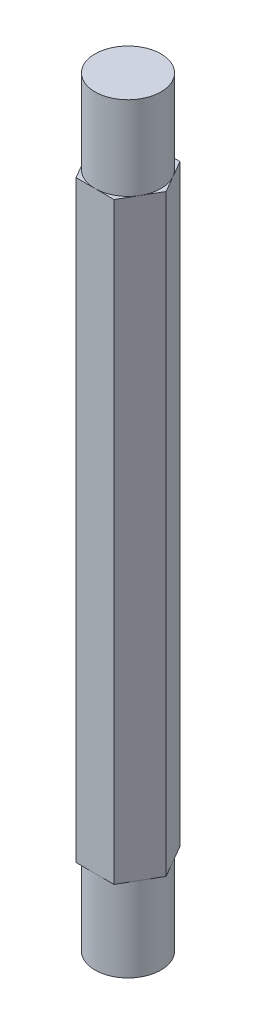
ISO-10303-21;
HEADER;
FILE_DESCRIPTION(('STEP AP214'),'2;1');
FILE_NAME('part.step','',(''),(''),'','','');
FILE_SCHEMA(('AUTOMOTIVE_DESIGN { 1 0 10303 214 1 1 1 1 }'));
ENDSEC;
DATA;
#1=APPLICATION_CONTEXT('core data for automotive mechanical design processes');
#2=APPLICATION_PROTOCOL_DEFINITION('international standard','automotive_design',2000,#1);
#3=PRODUCT_CONTEXT('',#1,'mechanical');
#4=PRODUCT('Part','Part','',(#3));
#5=PRODUCT_RELATED_PRODUCT_CATEGORY('part','',(#4));
#6=PRODUCT_DEFINITION_FORMATION('','',#4);
#7=PRODUCT_DEFINITION_CONTEXT('part definition',#1,'design');
#8=PRODUCT_DEFINITION('design','',#6,#7);
#9=PRODUCT_DEFINITION_SHAPE('','',#8);
#10=(LENGTH_UNIT() NAMED_UNIT(*) SI_UNIT(.MILLI.,.METRE.));
#11=(NAMED_UNIT(*) PLANE_ANGLE_UNIT() SI_UNIT($,.RADIAN.));
#12=(NAMED_UNIT(*) SI_UNIT($,.STERADIAN.) SOLID_ANGLE_UNIT());
#13=UNCERTAINTY_MEASURE_WITH_UNIT(LENGTH_MEASURE(1.E-05),#10,'distance_accuracy_value','');
#14=(GEOMETRIC_REPRESENTATION_CONTEXT(3) GLOBAL_UNCERTAINTY_ASSIGNED_CONTEXT((#13)) GLOBAL_UNIT_ASSIGNED_CONTEXT((#10,
#11,#12)) REPRESENTATION_CONTEXT('',''));
#15=CARTESIAN_POINT('',(0.,0.,0.));
#16=DIRECTION('',(0.,0.,1.));
#17=DIRECTION('',(1.,0.,0.));
#18=AXIS2_PLACEMENT_3D('',#15,#16,#17);
#19=CARTESIAN_POINT('',(2.88675134594813,57.699999944,0.));
#20=DIRECTION('',(-0.866025403784439,0.,0.5));
#21=DIRECTION('',(0.5,0.,0.866025403784439));
#22=AXIS2_PLACEMENT_3D('',#19,#20,#21);
#23=PLANE('',#22);
#24=DIRECTION('',(0.5,0.,0.866025403784439));
#25=VECTOR('',#24,1.);
#26=CARTESIAN_POINT('',(2.1650635094611,51.349999944,-1.25));
#27=LINE('',#26,#25);
#28=CARTESIAN_POINT('',(2.1650635094611,51.349999944,-1.25));
#29=VERTEX_POINT('',#28);
#30=CARTESIAN_POINT('',(2.88675134594813,51.349999944,0.));
#31=VERTEX_POINT('',#30);
#32=EDGE_CURVE('E214',#29,#31,#27,.T.);
#33=ORIENTED_EDGE('',*,*,#32,.T.);
#34=DIRECTION('',(0.,-1.,0.));
#35=VECTOR('',#34,1.);
#36=CARTESIAN_POINT('',(2.88675134594813,57.699999944,0.));
#37=LINE('',#36,#35);
#38=CARTESIAN_POINT('',(2.88675134594813,6.35,0.));
#39=VERTEX_POINT('',#38);
#40=EDGE_CURVE('E12',#31,#39,#37,.T.);
#41=ORIENTED_EDGE('',*,*,#40,.T.);
#42=DIRECTION('',(0.5,0.,0.866025403784439));
#43=VECTOR('',#42,1.);
#44=CARTESIAN_POINT('',(2.1650635094611,6.35,-1.25));
#45=LINE('',#44,#43);
#46=CARTESIAN_POINT('',(2.1650635094611,6.35,-1.25));
#47=VERTEX_POINT('',#46);
#48=EDGE_CURVE('E267',#47,#39,#45,.T.);
#49=ORIENTED_EDGE('',*,*,#48,.F.);
#50=DIRECTION('',(0.5,0.,0.866025403784439));
#51=VECTOR('',#50,1.);
#52=CARTESIAN_POINT('',(2.1650635094611,6.35,-1.25));
#53=LINE('',#52,#51);
#54=CARTESIAN_POINT('',(1.44337567297406,6.35,-2.50000000000001));
#55=VERTEX_POINT('',#54);
#56=EDGE_CURVE('E282',#55,#47,#53,.T.);
#57=ORIENTED_EDGE('',*,*,#56,.F.);
#58=DIRECTION('',(0.,-1.,0.));
#59=VECTOR('',#58,1.);
#60=CARTESIAN_POINT('',(1.44337567297406,57.699999944,-2.50000000000001));
#61=LINE('',#60,#59);
#62=CARTESIAN_POINT('',(1.44337567297406,51.349999944,-2.50000000000001));
#63=VERTEX_POINT('',#62);
#64=EDGE_CURVE('E113',#63,#55,#61,.T.);
#65=ORIENTED_EDGE('',*,*,#64,.F.);
#66=DIRECTION('',(0.5,0.,0.866025403784439));
#67=VECTOR('',#66,1.);
#68=CARTESIAN_POINT('',(2.1650635094611,51.349999944,-1.25));
#69=LINE('',#68,#67);
#70=EDGE_CURVE('E227',#63,#29,#69,.T.);
#71=ORIENTED_EDGE('',*,*,#70,.T.);
#72=EDGE_LOOP('',(#33,#41,#49,#57,#65,#71));
#73=FACE_BOUND('',#72,.T.);
#74=ADVANCED_FACE('F104',(#73),#23,.F.);
#75=CARTESIAN_POINT('',(-1.44337567297407,57.699999944,-2.50000000000001));
#76=DIRECTION('',(0.866025403784439,0.,0.5));
#77=DIRECTION('',(0.5,0.,-0.866025403784439));
#78=AXIS2_PLACEMENT_3D('',#75,#76,#77);
#79=PLANE('',#78);
#80=DIRECTION('',(0.5,0.,-0.866025403784439));
#81=VECTOR('',#80,1.);
#82=CARTESIAN_POINT('',(-2.1650635094611,51.349999944,-1.25));
#83=LINE('',#82,#81);
#84=CARTESIAN_POINT('',(-2.1650635094611,51.349999944,-1.25));
#85=VERTEX_POINT('',#84);
#86=CARTESIAN_POINT('',(-1.44337567297407,51.349999944,-2.50000000000001));
#87=VERTEX_POINT('',#86);
#88=EDGE_CURVE('E209',#85,#87,#83,.T.);
#89=ORIENTED_EDGE('',*,*,#88,.T.);
#90=DIRECTION('',(0.,-1.,0.));
#91=VECTOR('',#90,1.);
#92=CARTESIAN_POINT('',(-1.44337567297407,57.699999944,-2.50000000000001));
#93=LINE('',#92,#91);
#94=CARTESIAN_POINT('',(-1.44337567297407,6.35,-2.50000000000001));
#95=VERTEX_POINT('',#94);
#96=EDGE_CURVE('E220',#87,#95,#93,.T.);
#97=ORIENTED_EDGE('',*,*,#96,.T.);
#98=DIRECTION('',(0.5,0.,-0.866025403784439));
#99=VECTOR('',#98,1.);
#100=CARTESIAN_POINT('',(-2.1650635094611,6.35,-1.25));
#101=LINE('',#100,#99);
#102=CARTESIAN_POINT('',(-2.1650635094611,6.35,-1.25));
#103=VERTEX_POINT('',#102);
#104=EDGE_CURVE('E261',#103,#95,#101,.T.);
#105=ORIENTED_EDGE('',*,*,#104,.F.);
#106=DIRECTION('',(0.5,0.,-0.866025403784439));
#107=VECTOR('',#106,1.);
#108=CARTESIAN_POINT('',(-2.1650635094611,6.35,-1.25));
#109=LINE('',#108,#107);
#110=CARTESIAN_POINT('',(-2.88675134594813,6.35,0.));
#111=VERTEX_POINT('',#110);
#112=EDGE_CURVE('E292',#111,#103,#109,.T.);
#113=ORIENTED_EDGE('',*,*,#112,.F.);
#114=DIRECTION('',(0.,-1.,0.));
#115=VECTOR('',#114,1.);
#116=CARTESIAN_POINT('',(-2.88675134594813,57.699999944,0.));
#117=LINE('',#116,#115);
#118=CARTESIAN_POINT('',(-2.88675134594813,51.349999944,0.));
#119=VERTEX_POINT('',#118);
#120=EDGE_CURVE('E307',#119,#111,#117,.T.);
#121=ORIENTED_EDGE('',*,*,#120,.F.);
#122=DIRECTION('',(0.5,0.,-0.866025403784439));
#123=VECTOR('',#122,1.);
#124=CARTESIAN_POINT('',(-2.1650635094611,51.349999944,-1.25));
#125=LINE('',#124,#123);
#126=EDGE_CURVE('E254',#119,#85,#125,.T.);
#127=ORIENTED_EDGE('',*,*,#126,.T.);
#128=EDGE_LOOP('',(#89,#97,#105,#113,#121,#127));
#129=FACE_BOUND('',#128,.T.);
#130=ADVANCED_FACE('F311',(#129),#79,.F.);
#131=CARTESIAN_POINT('',(1.44337567297406,57.699999944,2.5));
#132=DIRECTION('',(-0.866025403784439,0.,-0.5));
#133=DIRECTION('',(-0.5,0.,0.866025403784439));
#134=AXIS2_PLACEMENT_3D('',#131,#132,#133);
#135=PLANE('',#134);
#136=DIRECTION('',(-0.5,0.,0.866025403784439));
#137=VECTOR('',#136,1.);
#138=CARTESIAN_POINT('',(2.1650635094611,51.349999944,1.25));
#139=LINE('',#138,#137);
#140=CARTESIAN_POINT('',(2.1650635094611,51.349999944,1.25));
#141=VERTEX_POINT('',#140);
#142=EDGE_CURVE('E517',#31,#141,#139,.T.);
#143=ORIENTED_EDGE('',*,*,#142,.T.);
#144=DIRECTION('',(-0.5,0.,0.866025403784439));
#145=VECTOR('',#144,1.);
#146=CARTESIAN_POINT('',(2.1650635094611,51.349999944,1.25));
#147=LINE('',#146,#145);
#148=CARTESIAN_POINT('',(1.44337567297406,51.349999944,2.5));
#149=VERTEX_POINT('',#148);
#150=EDGE_CURVE('E250',#141,#149,#147,.T.);
#151=ORIENTED_EDGE('',*,*,#150,.T.);
#152=DIRECTION('',(0.,-1.,0.));
#153=VECTOR('',#152,1.);
#154=CARTESIAN_POINT('',(1.44337567297406,57.699999944,2.5));
#155=LINE('',#154,#153);
#156=CARTESIAN_POINT('',(1.44337567297406,6.35,2.5));
#157=VERTEX_POINT('',#156);
#158=EDGE_CURVE('E120',#149,#157,#155,.T.);
#159=ORIENTED_EDGE('',*,*,#158,.T.);
#160=DIRECTION('',(-0.5,0.,0.866025403784439));
#161=VECTOR('',#160,1.);
#162=CARTESIAN_POINT('',(2.1650635094611,6.35,1.25));
#163=LINE('',#162,#161);
#164=CARTESIAN_POINT('',(2.1650635094611,6.35,1.25));
#165=VERTEX_POINT('',#164);
#166=EDGE_CURVE('E291',#165,#157,#163,.T.);
#167=ORIENTED_EDGE('',*,*,#166,.F.);
#168=DIRECTION('',(-0.5,0.,0.866025403784439));
#169=VECTOR('',#168,1.);
#170=CARTESIAN_POINT('',(2.1650635094611,6.35,1.25));
#171=LINE('',#170,#169);
#172=EDGE_CURVE('E262',#39,#165,#171,.T.);
#173=ORIENTED_EDGE('',*,*,#172,.F.);
#174=ORIENTED_EDGE('',*,*,#40,.F.);
#175=EDGE_LOOP('',(#143,#151,#159,#167,#173,#174));
#176=FACE_BOUND('',#175,.T.);
#177=ADVANCED_FACE('F106',(#176),#135,.F.);
#178=CARTESIAN_POINT('',(1.44337567297406,57.699999944,-2.50000000000001));
#179=DIRECTION('',(0.,0.,1.));
#180=DIRECTION('',(1.,0.,0.));
#181=AXIS2_PLACEMENT_3D('',#178,#179,#180);
#182=PLANE('',#181);
#183=DIRECTION('',(1.,0.,0.));
#184=VECTOR('',#183,1.);
#185=CARTESIAN_POINT('',(0.,51.349999944,-2.50000000000001));
#186=LINE('',#185,#184);
#187=CARTESIAN_POINT('',(0.,51.349999944,-2.50000000000001));
#188=VERTEX_POINT('',#187);
#189=EDGE_CURVE('E207',#87,#188,#186,.T.);
#190=ORIENTED_EDGE('',*,*,#189,.T.);
#191=DIRECTION('',(1.,0.,0.));
#192=VECTOR('',#191,1.);
#193=CARTESIAN_POINT('',(0.,51.349999944,-2.50000000000001));
#194=LINE('',#193,#192);
#195=EDGE_CURVE('E219',#188,#63,#194,.T.);
#196=ORIENTED_EDGE('',*,*,#195,.T.);
#197=ORIENTED_EDGE('',*,*,#64,.T.);
#198=DIRECTION('',(1.,0.,0.));
#199=VECTOR('',#198,1.);
#200=CARTESIAN_POINT('',(0.,6.35,-2.50000000000001));
#201=LINE('',#200,#199);
#202=CARTESIAN_POINT('',(0.,6.35,-2.50000000000001));
#203=VERTEX_POINT('',#202);
#204=EDGE_CURVE('E280',#203,#55,#201,.T.);
#205=ORIENTED_EDGE('',*,*,#204,.F.);
#206=DIRECTION('',(1.,0.,0.));
#207=VECTOR('',#206,1.);
#208=CARTESIAN_POINT('',(0.,6.35,-2.50000000000001));
#209=LINE('',#208,#207);
#210=EDGE_CURVE('E147',#95,#203,#209,.T.);
#211=ORIENTED_EDGE('',*,*,#210,.F.);
#212=ORIENTED_EDGE('',*,*,#96,.F.);
#213=EDGE_LOOP('',(#190,#196,#197,#205,#211,#212));
#214=FACE_BOUND('',#213,.T.);
#215=ADVANCED_FACE('F218',(#214),#182,.F.);
#216=CARTESIAN_POINT('',(-1.44337567297407,57.699999944,2.5));
#217=DIRECTION('',(0.,0.,-1.));
#218=DIRECTION('',(-1.,0.,0.));
#219=AXIS2_PLACEMENT_3D('',#216,#217,#218);
#220=PLANE('',#219);
#221=DIRECTION('',(-1.,0.,0.));
#222=VECTOR('',#221,1.);
#223=CARTESIAN_POINT('',(0.,51.349999944,2.5));
#224=LINE('',#223,#222);
#225=CARTESIAN_POINT('',(0.,51.349999944,2.5));
#226=VERTEX_POINT('',#225);
#227=CARTESIAN_POINT('',(-1.44337567297407,51.349999944,2.5));
#228=VERTEX_POINT('',#227);
#229=EDGE_CURVE('E238',#226,#228,#224,.T.);
#230=ORIENTED_EDGE('',*,*,#229,.T.);
#231=DIRECTION('',(0.,-1.,0.));
#232=VECTOR('',#231,1.);
#233=CARTESIAN_POINT('',(-1.44337567297407,57.699999944,2.5));
#234=LINE('',#233,#232);
#235=CARTESIAN_POINT('',(-1.44337567297407,6.35,2.5));
#236=VERTEX_POINT('',#235);
#237=EDGE_CURVE('E305',#228,#236,#234,.T.);
#238=ORIENTED_EDGE('',*,*,#237,.T.);
#239=DIRECTION('',(-1.,0.,0.));
#240=VECTOR('',#239,1.);
#241=CARTESIAN_POINT('',(0.,6.35,2.5));
#242=LINE('',#241,#240);
#243=CARTESIAN_POINT('',(0.,6.35,2.5));
#244=VERTEX_POINT('',#243);
#245=EDGE_CURVE('E273',#244,#236,#242,.T.);
#246=ORIENTED_EDGE('',*,*,#245,.F.);
#247=DIRECTION('',(-1.,0.,0.));
#248=VECTOR('',#247,1.);
#249=CARTESIAN_POINT('',(0.,6.35,2.5));
#250=LINE('',#249,#248);
#251=EDGE_CURVE('E294',#157,#244,#250,.T.);
#252=ORIENTED_EDGE('',*,*,#251,.F.);
#253=ORIENTED_EDGE('',*,*,#158,.F.);
#254=DIRECTION('',(-1.,0.,0.));
#255=VECTOR('',#254,1.);
#256=CARTESIAN_POINT('',(0.,51.349999944,2.5));
#257=LINE('',#256,#255);
#258=EDGE_CURVE('E246',#149,#226,#257,.T.);
#259=ORIENTED_EDGE('',*,*,#258,.T.);
#260=EDGE_LOOP('',(#230,#238,#246,#252,#253,#259));
#261=FACE_BOUND('',#260,.T.);
#262=ADVANCED_FACE('F348',(#261),#220,.F.);
#263=CARTESIAN_POINT('',(-2.88675134594813,57.699999944,0.));
#264=DIRECTION('',(0.866025403784439,0.,-0.5));
#265=DIRECTION('',(-0.5,0.,-0.866025403784439));
#266=AXIS2_PLACEMENT_3D('',#263,#264,#265);
#267=PLANE('',#266);
#268=DIRECTION('',(-0.5,0.,-0.866025403784439));
#269=VECTOR('',#268,1.);
#270=CARTESIAN_POINT('',(-2.1650635094611,51.349999944,1.25));
#271=LINE('',#270,#269);
#272=CARTESIAN_POINT('',(-2.1650635094611,51.349999944,1.25));
#273=VERTEX_POINT('',#272);
#274=EDGE_CURVE('E336',#228,#273,#271,.T.);
#275=ORIENTED_EDGE('',*,*,#274,.T.);
#276=DIRECTION('',(-0.5,0.,-0.866025403784439));
#277=VECTOR('',#276,1.);
#278=CARTESIAN_POINT('',(-2.1650635094611,51.349999944,1.25));
#279=LINE('',#278,#277);
#280=EDGE_CURVE('E247',#273,#119,#279,.T.);
#281=ORIENTED_EDGE('',*,*,#280,.T.);
#282=ORIENTED_EDGE('',*,*,#120,.T.);
#283=DIRECTION('',(-0.5,0.,-0.866025403784439));
#284=VECTOR('',#283,1.);
#285=CARTESIAN_POINT('',(-2.1650635094611,6.35,1.25));
#286=LINE('',#285,#284);
#287=CARTESIAN_POINT('',(-2.1650635094611,6.35,1.25));
#288=VERTEX_POINT('',#287);
#289=EDGE_CURVE('E299',#288,#111,#286,.T.);
#290=ORIENTED_EDGE('',*,*,#289,.F.);
#291=DIRECTION('',(-0.5,0.,-0.866025403784439));
#292=VECTOR('',#291,1.);
#293=CARTESIAN_POINT('',(-2.1650635094611,6.35,1.25));
#294=LINE('',#293,#292);
#295=EDGE_CURVE('E132',#236,#288,#294,.T.);
#296=ORIENTED_EDGE('',*,*,#295,.F.);
#297=ORIENTED_EDGE('',*,*,#237,.F.);
#298=EDGE_LOOP('',(#275,#281,#282,#290,#296,#297));
#299=FACE_BOUND('',#298,.T.);
#300=ADVANCED_FACE('F333',(#299),#267,.F.);
#301=CARTESIAN_POINT('',(0.,0.,0.));
#302=DIRECTION('',(0.,1.,0.));
#303=DIRECTION('',(0.,0.,1.));
#304=AXIS2_PLACEMENT_3D('',#301,#302,#303);
#305=PLANE('',#304);
#306=CARTESIAN_POINT('',(0.,0.,0.));
#307=DIRECTION('',(0.,-1.,0.));
#308=DIRECTION('',(0.,0.,-1.));
#309=AXIS2_PLACEMENT_3D('',#306,#307,#308);
#310=CIRCLE('',#309,2.5);
#311=CARTESIAN_POINT('',(0.,0.,-2.5));
#312=VERTEX_POINT('',#311);
#313=EDGE_CURVE('E276',#312,#312,#310,.T.);
#314=ORIENTED_EDGE('',*,*,#313,.T.);
#315=EDGE_LOOP('',(#314));
#316=FACE_BOUND('',#315,.T.);
#317=ADVANCED_FACE('F375',(#316),#305,.F.);
#318=CARTESIAN_POINT('',(0.,57.699999944,0.));
#319=DIRECTION('',(0.,1.,0.));
#320=DIRECTION('',(0.,0.,1.));
#321=AXIS2_PLACEMENT_3D('',#318,#319,#320);
#322=PLANE('',#321);
#323=CARTESIAN_POINT('',(0.,57.699999944,0.));
#324=DIRECTION('',(0.,-1.,0.));
#325=DIRECTION('',(0.,0.,-1.));
#326=AXIS2_PLACEMENT_3D('',#323,#324,#325);
#327=CIRCLE('',#326,2.5);
#328=CARTESIAN_POINT('',(0.,57.699999944,-2.5));
#329=VERTEX_POINT('',#328);
#330=EDGE_CURVE('E234',#329,#329,#327,.T.);
#331=ORIENTED_EDGE('',*,*,#330,.F.);
#332=EDGE_LOOP('',(#331));
#333=FACE_BOUND('',#332,.T.);
#334=ADVANCED_FACE('F380',(#333),#322,.T.);
#335=CARTESIAN_POINT('',(0.,6.35,0.));
#336=DIRECTION('',(0.,-1.,0.));
#337=DIRECTION('',(0.,0.,-1.));
#338=AXIS2_PLACEMENT_3D('',#335,#336,#337);
#339=PLANE('',#338);
#340=CARTESIAN_POINT('',(0.,6.35,0.));
#341=DIRECTION('',(0.,-1.,0.));
#342=DIRECTION('',(0.,0.,-1.));
#343=AXIS2_PLACEMENT_3D('',#340,#341,#342);
#344=CIRCLE('',#343,2.5);
#345=EDGE_CURVE('E288',#165,#244,#344,.T.);
#346=ORIENTED_EDGE('',*,*,#345,.F.);
#347=ORIENTED_EDGE('',*,*,#166,.T.);
#348=ORIENTED_EDGE('',*,*,#251,.T.);
#349=EDGE_LOOP('',(#346,#347,#348));
#350=FACE_BOUND('',#349,.T.);
#351=ADVANCED_FACE('F353',(#350),#339,.T.);
#352=CARTESIAN_POINT('',(0.,6.35,0.));
#353=DIRECTION('',(0.,-1.,0.));
#354=DIRECTION('',(0.,0.,-1.));
#355=AXIS2_PLACEMENT_3D('',#352,#353,#354);
#356=PLANE('',#355);
#357=CARTESIAN_POINT('',(0.,6.35,0.));
#358=DIRECTION('',(0.,-1.,0.));
#359=DIRECTION('',(0.,0.,-1.));
#360=AXIS2_PLACEMENT_3D('',#357,#358,#359);
#361=CIRCLE('',#360,2.5);
#362=EDGE_CURVE('E285',#288,#103,#361,.T.);
#363=ORIENTED_EDGE('',*,*,#362,.F.);
#364=ORIENTED_EDGE('',*,*,#289,.T.);
#365=ORIENTED_EDGE('',*,*,#112,.T.);
#366=EDGE_LOOP('',(#363,#364,#365));
#367=FACE_BOUND('',#366,.T.);
#368=ADVANCED_FACE('F329',(#367),#356,.T.);
#369=CARTESIAN_POINT('',(0.,6.35,0.));
#370=DIRECTION('',(0.,-1.,0.));
#371=DIRECTION('',(0.,0.,-1.));
#372=AXIS2_PLACEMENT_3D('',#369,#370,#371);
#373=CYLINDRICAL_SURFACE('',#372,2.5);
#374=ORIENTED_EDGE('',*,*,#313,.F.);
#375=EDGE_LOOP('',(#374));
#376=FACE_BOUND('',#375,.T.);
#377=ORIENTED_EDGE('',*,*,#362,.T.);
#378=CARTESIAN_POINT('',(0.,6.35,0.));
#379=DIRECTION('',(0.,-1.,0.));
#380=DIRECTION('',(0.,0.,-1.));
#381=AXIS2_PLACEMENT_3D('',#378,#379,#380);
#382=CIRCLE('',#381,2.5);
#383=EDGE_CURVE('E259',#103,#203,#382,.T.);
#384=ORIENTED_EDGE('',*,*,#383,.T.);
#385=CARTESIAN_POINT('',(0.,6.35,0.));
#386=DIRECTION('',(0.,-1.,0.));
#387=DIRECTION('',(0.,0.,-1.));
#388=AXIS2_PLACEMENT_3D('',#385,#386,#387);
#389=CIRCLE('',#388,2.5);
#390=EDGE_CURVE('E277',#203,#47,#389,.T.);
#391=ORIENTED_EDGE('',*,*,#390,.T.);
#392=CARTESIAN_POINT('',(0.,6.35,0.));
#393=DIRECTION('',(0.,-1.,0.));
#394=DIRECTION('',(0.,0.,-1.));
#395=AXIS2_PLACEMENT_3D('',#392,#393,#394);
#396=CIRCLE('',#395,2.5);
#397=EDGE_CURVE('E252',#47,#165,#396,.T.);
#398=ORIENTED_EDGE('',*,*,#397,.T.);
#399=ORIENTED_EDGE('',*,*,#345,.T.);
#400=CARTESIAN_POINT('',(0.,6.35,0.));
#401=DIRECTION('',(0.,-1.,0.));
#402=DIRECTION('',(0.,0.,-1.));
#403=AXIS2_PLACEMENT_3D('',#400,#401,#402);
#404=CIRCLE('',#403,2.5);
#405=EDGE_CURVE('E265',#244,#288,#404,.T.);
#406=ORIENTED_EDGE('',*,*,#405,.T.);
#407=EDGE_LOOP('',(#377,#384,#391,#398,#399,#406));
#408=FACE_BOUND('',#407,.T.);
#409=ADVANCED_FACE('F325',(#376,#408),#373,.T.);
#410=CARTESIAN_POINT('',(0.,6.35,0.));
#411=DIRECTION('',(0.,-1.,0.));
#412=DIRECTION('',(0.,0.,-1.));
#413=AXIS2_PLACEMENT_3D('',#410,#411,#412);
#414=PLANE('',#413);
#415=ORIENTED_EDGE('',*,*,#390,.F.);
#416=ORIENTED_EDGE('',*,*,#204,.T.);
#417=ORIENTED_EDGE('',*,*,#56,.T.);
#418=EDGE_LOOP('',(#415,#416,#417));
#419=FACE_BOUND('',#418,.T.);
#420=ADVANCED_FACE('F317',(#419),#414,.T.);
#421=CARTESIAN_POINT('',(0.,6.35,0.));
#422=DIRECTION('',(0.,-1.,0.));
#423=DIRECTION('',(0.,0.,-1.));
#424=AXIS2_PLACEMENT_3D('',#421,#422,#423);
#425=PLANE('',#424);
#426=ORIENTED_EDGE('',*,*,#405,.F.);
#427=ORIENTED_EDGE('',*,*,#245,.T.);
#428=ORIENTED_EDGE('',*,*,#295,.T.);
#429=EDGE_LOOP('',(#426,#427,#428));
#430=FACE_BOUND('',#429,.T.);
#431=ADVANCED_FACE('F357',(#430),#425,.T.);
#432=CARTESIAN_POINT('',(0.,6.35,0.));
#433=DIRECTION('',(0.,-1.,0.));
#434=DIRECTION('',(0.,0.,-1.));
#435=AXIS2_PLACEMENT_3D('',#432,#433,#434);
#436=PLANE('',#435);
#437=ORIENTED_EDGE('',*,*,#397,.F.);
#438=ORIENTED_EDGE('',*,*,#48,.T.);
#439=ORIENTED_EDGE('',*,*,#172,.T.);
#440=EDGE_LOOP('',(#437,#438,#439));
#441=FACE_BOUND('',#440,.T.);
#442=ADVANCED_FACE('F355',(#441),#436,.T.);
#443=CARTESIAN_POINT('',(0.,6.35,0.));
#444=DIRECTION('',(0.,-1.,0.));
#445=DIRECTION('',(0.,0.,-1.));
#446=AXIS2_PLACEMENT_3D('',#443,#444,#445);
#447=PLANE('',#446);
#448=ORIENTED_EDGE('',*,*,#383,.F.);
#449=ORIENTED_EDGE('',*,*,#104,.T.);
#450=ORIENTED_EDGE('',*,*,#210,.T.);
#451=EDGE_LOOP('',(#448,#449,#450));
#452=FACE_BOUND('',#451,.T.);
#453=ADVANCED_FACE('F313',(#452),#447,.T.);
#454=CARTESIAN_POINT('',(0.,51.349999944,0.));
#455=DIRECTION('',(0.,1.,0.));
#456=DIRECTION('',(0.,0.,-1.));
#457=AXIS2_PLACEMENT_3D('',#454,#455,#456);
#458=PLANE('',#457);
#459=CARTESIAN_POINT('',(0.,51.349999944,0.));
#460=DIRECTION('',(0.,-1.,0.));
#461=DIRECTION('',(0.,0.,-1.));
#462=AXIS2_PLACEMENT_3D('',#459,#460,#461);
#463=CIRCLE('',#462,2.5);
#464=EDGE_CURVE('E243',#141,#226,#463,.T.);
#465=ORIENTED_EDGE('',*,*,#464,.T.);
#466=ORIENTED_EDGE('',*,*,#258,.F.);
#467=ORIENTED_EDGE('',*,*,#150,.F.);
#468=EDGE_LOOP('',(#465,#466,#467));
#469=FACE_BOUND('',#468,.T.);
#470=ADVANCED_FACE('F345',(#469),#458,.T.);
#471=CARTESIAN_POINT('',(0.,51.349999944,0.));
#472=DIRECTION('',(0.,1.,0.));
#473=DIRECTION('',(0.,0.,-1.));
#474=AXIS2_PLACEMENT_3D('',#471,#472,#473);
#475=PLANE('',#474);
#476=CARTESIAN_POINT('',(0.,51.349999944,0.));
#477=DIRECTION('',(0.,-1.,0.));
#478=DIRECTION('',(0.,0.,-1.));
#479=AXIS2_PLACEMENT_3D('',#476,#477,#478);
#480=CIRCLE('',#479,2.5);
#481=EDGE_CURVE('E228',#273,#85,#480,.T.);
#482=ORIENTED_EDGE('',*,*,#481,.T.);
#483=ORIENTED_EDGE('',*,*,#126,.F.);
#484=ORIENTED_EDGE('',*,*,#280,.F.);
#485=EDGE_LOOP('',(#482,#483,#484));
#486=FACE_BOUND('',#485,.T.);
#487=ADVANCED_FACE('F338',(#486),#475,.T.);
#488=CARTESIAN_POINT('',(0.,51.349999944,0.));
#489=DIRECTION('',(0.,1.,0.));
#490=DIRECTION('',(0.,0.,1.));
#491=AXIS2_PLACEMENT_3D('',#488,#489,#490);
#492=CYLINDRICAL_SURFACE('',#491,2.5);
#493=ORIENTED_EDGE('',*,*,#330,.T.);
#494=EDGE_LOOP('',(#493));
#495=FACE_BOUND('',#494,.T.);
#496=CARTESIAN_POINT('',(0.,51.349999944,0.));
#497=DIRECTION('',(0.,-1.,0.));
#498=DIRECTION('',(0.,0.,-1.));
#499=AXIS2_PLACEMENT_3D('',#496,#497,#498);
#500=CIRCLE('',#499,2.5);
#501=EDGE_CURVE('E204',#85,#188,#500,.T.);
#502=ORIENTED_EDGE('',*,*,#501,.F.);
#503=ORIENTED_EDGE('',*,*,#481,.F.);
#504=CARTESIAN_POINT('',(0.,51.349999944,0.));
#505=DIRECTION('',(0.,-1.,0.));
#506=DIRECTION('',(0.,0.,-1.));
#507=AXIS2_PLACEMENT_3D('',#504,#505,#506);
#508=CIRCLE('',#507,2.5);
#509=EDGE_CURVE('E340',#226,#273,#508,.T.);
#510=ORIENTED_EDGE('',*,*,#509,.F.);
#511=ORIENTED_EDGE('',*,*,#464,.F.);
#512=CARTESIAN_POINT('',(0.,51.349999944,0.));
#513=DIRECTION('',(0.,-1.,0.));
#514=DIRECTION('',(0.,0.,-1.));
#515=AXIS2_PLACEMENT_3D('',#512,#513,#514);
#516=CIRCLE('',#515,2.5);
#517=EDGE_CURVE('E232',#29,#141,#516,.T.);
#518=ORIENTED_EDGE('',*,*,#517,.F.);
#519=CARTESIAN_POINT('',(0.,51.349999944,0.));
#520=DIRECTION('',(0.,-1.,0.));
#521=DIRECTION('',(0.,0.,-1.));
#522=AXIS2_PLACEMENT_3D('',#519,#520,#521);
#523=CIRCLE('',#522,2.5);
#524=EDGE_CURVE('E225',#188,#29,#523,.T.);
#525=ORIENTED_EDGE('',*,*,#524,.F.);
#526=EDGE_LOOP('',(#502,#503,#510,#511,#518,#525));
#527=FACE_BOUND('',#526,.T.);
#528=ADVANCED_FACE('F230',(#495,#527),#492,.T.);
#529=CARTESIAN_POINT('',(0.,51.349999944,0.));
#530=DIRECTION('',(0.,1.,0.));
#531=DIRECTION('',(0.,0.,-1.));
#532=AXIS2_PLACEMENT_3D('',#529,#530,#531);
#533=PLANE('',#532);
#534=ORIENTED_EDGE('',*,*,#524,.T.);
#535=ORIENTED_EDGE('',*,*,#70,.F.);
#536=ORIENTED_EDGE('',*,*,#195,.F.);
#537=EDGE_LOOP('',(#534,#535,#536));
#538=FACE_BOUND('',#537,.T.);
#539=ADVANCED_FACE('F224',(#538),#533,.T.);
#540=CARTESIAN_POINT('',(0.,51.349999944,0.));
#541=DIRECTION('',(0.,1.,0.));
#542=DIRECTION('',(0.,0.,-1.));
#543=AXIS2_PLACEMENT_3D('',#540,#541,#542);
#544=PLANE('',#543);
#545=ORIENTED_EDGE('',*,*,#509,.T.);
#546=ORIENTED_EDGE('',*,*,#274,.F.);
#547=ORIENTED_EDGE('',*,*,#229,.F.);
#548=EDGE_LOOP('',(#545,#546,#547));
#549=FACE_BOUND('',#548,.T.);
#550=ADVANCED_FACE('F487',(#549),#544,.T.);
#551=CARTESIAN_POINT('',(0.,51.349999944,0.));
#552=DIRECTION('',(0.,1.,0.));
#553=DIRECTION('',(0.,0.,-1.));
#554=AXIS2_PLACEMENT_3D('',#551,#552,#553);
#555=PLANE('',#554);
#556=ORIENTED_EDGE('',*,*,#517,.T.);
#557=ORIENTED_EDGE('',*,*,#142,.F.);
#558=ORIENTED_EDGE('',*,*,#32,.F.);
#559=EDGE_LOOP('',(#556,#557,#558));
#560=FACE_BOUND('',#559,.T.);
#561=ADVANCED_FACE('F496',(#560),#555,.T.);
#562=CARTESIAN_POINT('',(0.,51.349999944,0.));
#563=DIRECTION('',(0.,1.,0.));
#564=DIRECTION('',(0.,0.,-1.));
#565=AXIS2_PLACEMENT_3D('',#562,#563,#564);
#566=PLANE('',#565);
#567=ORIENTED_EDGE('',*,*,#501,.T.);
#568=ORIENTED_EDGE('',*,*,#189,.F.);
#569=ORIENTED_EDGE('',*,*,#88,.F.);
#570=EDGE_LOOP('',(#567,#568,#569));
#571=FACE_BOUND('',#570,.T.);
#572=ADVANCED_FACE('F206',(#571),#566,.T.);
#573=CLOSED_SHELL('',(#74,#130,#177,#215,#262,#300,#317,#334,#351,#368,#409,#420,#431,#442,#453,
#470,#487,#528,#539,#550,#561,#572));
#574=MANIFOLD_SOLID_BREP('B2',#573);
#575=ADVANCED_BREP_SHAPE_REPRESENTATION('',(#18,#574),#14);
#576=SHAPE_DEFINITION_REPRESENTATION(#9,#575);
ENDSEC;
END-ISO-10303-21;
